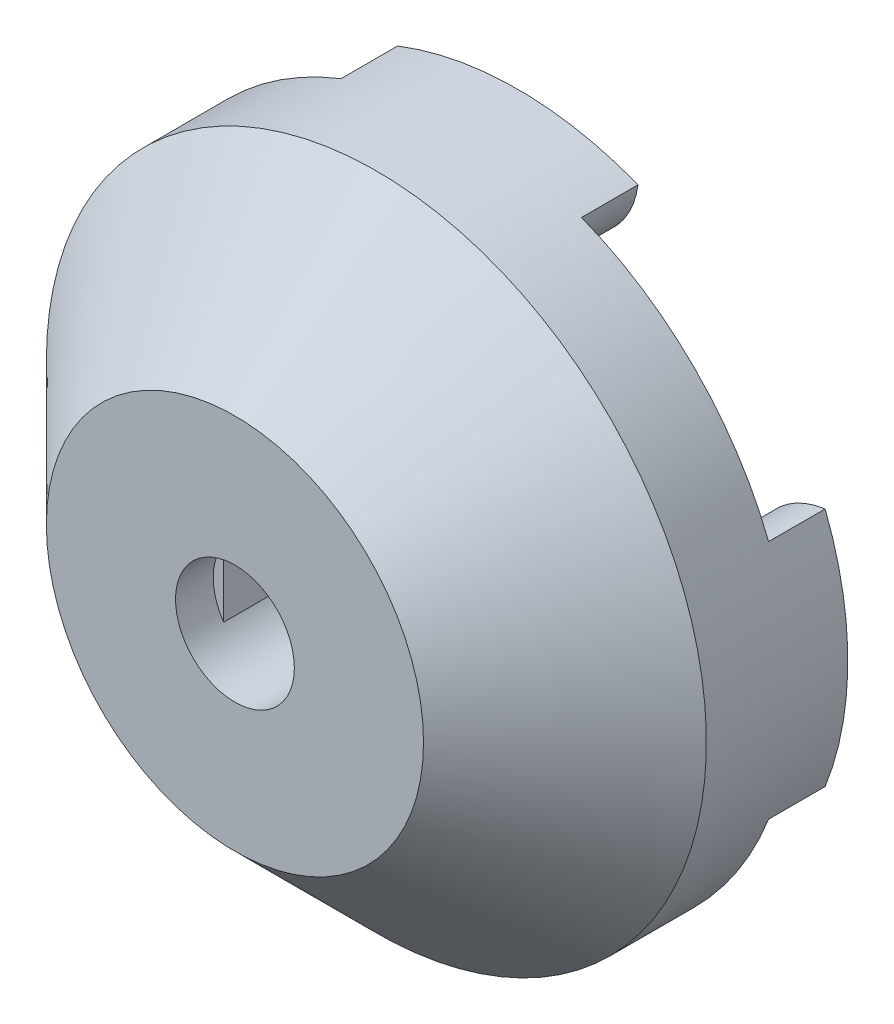
ISO-10303-21;
HEADER;
FILE_DESCRIPTION(('STEP AP214'),'2;1');
FILE_NAME('part.step','',(''),(''),'','','');
FILE_SCHEMA(('AUTOMOTIVE_DESIGN { 1 0 10303 214 1 1 1 1 }'));
ENDSEC;
DATA;
#1=APPLICATION_CONTEXT('core data for automotive mechanical design processes');
#2=APPLICATION_PROTOCOL_DEFINITION('international standard','automotive_design',2000,#1);
#3=PRODUCT_CONTEXT('',#1,'mechanical');
#4=PRODUCT('Part','Part','',(#3));
#5=PRODUCT_RELATED_PRODUCT_CATEGORY('part','',(#4));
#6=PRODUCT_DEFINITION_FORMATION('','',#4);
#7=PRODUCT_DEFINITION_CONTEXT('part definition',#1,'design');
#8=PRODUCT_DEFINITION('design','',#6,#7);
#9=PRODUCT_DEFINITION_SHAPE('','',#8);
#10=(LENGTH_UNIT() NAMED_UNIT(*) SI_UNIT(.MILLI.,.METRE.));
#11=(NAMED_UNIT(*) PLANE_ANGLE_UNIT() SI_UNIT($,.RADIAN.));
#12=(NAMED_UNIT(*) SI_UNIT($,.STERADIAN.) SOLID_ANGLE_UNIT());
#13=UNCERTAINTY_MEASURE_WITH_UNIT(LENGTH_MEASURE(1.E-05),#10,'distance_accuracy_value','');
#14=(GEOMETRIC_REPRESENTATION_CONTEXT(3) GLOBAL_UNCERTAINTY_ASSIGNED_CONTEXT((#13)) GLOBAL_UNIT_ASSIGNED_CONTEXT((#10,
#11,#12)) REPRESENTATION_CONTEXT('',''));
#15=CARTESIAN_POINT('',(0.,0.,0.));
#16=DIRECTION('',(0.,0.,1.));
#17=DIRECTION('',(1.,0.,0.));
#18=AXIS2_PLACEMENT_3D('',#15,#16,#17);
#19=CARTESIAN_POINT('',(-2.6,1.77834192437787,-15.));
#20=DIRECTION('',(-1.,0.,0.));
#21=DIRECTION('',(0.,0.,1.));
#22=AXIS2_PLACEMENT_3D('',#19,#20,#21);
#23=PLANE('',#22);
#24=DIRECTION('',(0.,1.,0.));
#25=VECTOR('',#24,1.);
#26=CARTESIAN_POINT('',(-2.6,1.77834192437787,-2.));
#27=LINE('',#26,#25);
#28=CARTESIAN_POINT('',(-2.6,-1.77834192437787,-2.));
#29=VERTEX_POINT('',#28);
#30=CARTESIAN_POINT('',(-2.6,1.77834192437787,-2.));
#31=VERTEX_POINT('',#30);
#32=EDGE_CURVE('E167',#29,#31,#27,.T.);
#33=ORIENTED_EDGE('',*,*,#32,.F.);
#34=DIRECTION('',(0.,0.,1.));
#35=VECTOR('',#34,1.);
#36=CARTESIAN_POINT('',(-2.6,-1.77834192437787,-15.));
#37=LINE('',#36,#35);
#38=CARTESIAN_POINT('',(-2.6,-1.77834192437787,-11.5));
#39=VERTEX_POINT('',#38);
#40=EDGE_CURVE('E178',#39,#29,#37,.T.);
#41=ORIENTED_EDGE('',*,*,#40,.F.);
#42=DIRECTION('',(0.,-1.,0.));
#43=VECTOR('',#42,1.);
#44=CARTESIAN_POINT('',(-2.6,1.77834192437787,-11.5));
#45=LINE('',#44,#43);
#46=CARTESIAN_POINT('',(-2.6,1.77834192437787,-11.5));
#47=VERTEX_POINT('',#46);
#48=EDGE_CURVE('E175',#47,#39,#45,.T.);
#49=ORIENTED_EDGE('',*,*,#48,.F.);
#50=DIRECTION('',(0.,0.,1.));
#51=VECTOR('',#50,1.);
#52=CARTESIAN_POINT('',(-2.6,1.77834192437787,-15.));
#53=LINE('',#52,#51);
#54=EDGE_CURVE('E180',#47,#31,#53,.T.);
#55=ORIENTED_EDGE('',*,*,#54,.T.);
#56=EDGE_LOOP('',(#33,#41,#49,#55));
#57=FACE_BOUND('',#56,.T.);
#58=ADVANCED_FACE('F43',(#57),#23,.F.);
#59=CARTESIAN_POINT('',(0.,0.,-15.));
#60=DIRECTION('',(0.,0.,1.));
#61=DIRECTION('',(1.,0.,0.));
#62=AXIS2_PLACEMENT_3D('',#59,#60,#61);
#63=CYLINDRICAL_SURFACE('',#62,3.15);
#64=CARTESIAN_POINT('',(0.,0.,0.));
#65=DIRECTION('',(0.,0.,1.));
#66=DIRECTION('',(1.,0.,0.));
#67=AXIS2_PLACEMENT_3D('',#64,#65,#66);
#68=CIRCLE('',#67,3.15);
#69=CARTESIAN_POINT('',(3.15,0.,0.));
#70=VERTEX_POINT('',#69);
#71=EDGE_CURVE('E182',#70,#70,#68,.T.);
#72=ORIENTED_EDGE('',*,*,#71,.T.);
#73=EDGE_LOOP('',(#72));
#74=FACE_BOUND('',#73,.T.);
#75=ORIENTED_EDGE('',*,*,#40,.T.);
#76=CARTESIAN_POINT('',(0.,0.,-2.));
#77=DIRECTION('',(0.,0.,1.));
#78=DIRECTION('',(1.,0.,0.));
#79=AXIS2_PLACEMENT_3D('',#76,#77,#78);
#80=CIRCLE('',#79,3.15);
#81=EDGE_CURVE('E59',#31,#29,#80,.T.);
#82=ORIENTED_EDGE('',*,*,#81,.F.);
#83=ORIENTED_EDGE('',*,*,#54,.F.);
#84=CARTESIAN_POINT('',(0.,0.,-11.5));
#85=DIRECTION('',(0.,0.,-1.));
#86=DIRECTION('',(-1.,0.,0.));
#87=AXIS2_PLACEMENT_3D('',#84,#85,#86);
#88=CIRCLE('',#87,3.15);
#89=EDGE_CURVE('E61',#39,#47,#88,.F.);
#90=ORIENTED_EDGE('',*,*,#89,.F.);
#91=EDGE_LOOP('',(#75,#82,#83,#90));
#92=FACE_BOUND('',#91,.T.);
#93=ADVANCED_FACE('F176',(#74,#92),#63,.F.);
#94=CARTESIAN_POINT('',(0.,0.,-12.));
#95=DIRECTION('',(0.,0.,1.));
#96=DIRECTION('',(1.,0.,0.));
#97=AXIS2_PLACEMENT_3D('',#94,#95,#96);
#98=CYLINDRICAL_SURFACE('',#97,17.5);
#99=CARTESIAN_POINT('',(0.,0.,-7.50000000000003));
#100=DIRECTION('',(0.,0.,1.));
#101=DIRECTION('',(1.,0.,0.));
#102=AXIS2_PLACEMENT_3D('',#99,#100,#101);
#103=CIRCLE('',#102,17.5);
#104=CARTESIAN_POINT('',(-17.5,0.,-7.50000000000003));
#105=VERTEX_POINT('',#104);
#106=EDGE_CURVE('E11',#105,#105,#103,.F.);
#107=ORIENTED_EDGE('',*,*,#106,.T.);
#108=EDGE_LOOP('',(#107));
#109=FACE_BOUND('',#108,.T.);
#110=CARTESIAN_POINT('',(0.,0.,-12.));
#111=DIRECTION('',(0.,0.,1.));
#112=DIRECTION('',(1.,0.,0.));
#113=AXIS2_PLACEMENT_3D('',#110,#111,#112);
#114=CIRCLE('',#113,17.5);
#115=CARTESIAN_POINT('',(6.37499999999999,-16.2975266528391,-12.));
#116=VERTEX_POINT('',#115);
#117=CARTESIAN_POINT('',(16.2975266528391,-6.37499999999994,-12.));
#118=VERTEX_POINT('',#117);
#119=EDGE_CURVE('E313',#116,#118,#114,.T.);
#120=ORIENTED_EDGE('',*,*,#119,.T.);
#121=DIRECTION('',(0.,0.,1.));
#122=VECTOR('',#121,1.);
#123=CARTESIAN_POINT('',(16.2975266528391,-6.37499999999995,-15.));
#124=LINE('',#123,#122);
#125=CARTESIAN_POINT('',(16.2975266528391,-6.37499999999995,-15.));
#126=VERTEX_POINT('',#125);
#127=EDGE_CURVE('E218',#126,#118,#124,.T.);
#128=ORIENTED_EDGE('',*,*,#127,.F.);
#129=CARTESIAN_POINT('',(0.,0.,-15.));
#130=DIRECTION('',(0.,0.,-1.));
#131=DIRECTION('',(0.,-1.,0.));
#132=AXIS2_PLACEMENT_3D('',#129,#130,#131);
#133=CIRCLE('',#132,17.5);
#134=CARTESIAN_POINT('',(16.2975266528391,6.37500000000005,-15.));
#135=VERTEX_POINT('',#134);
#136=EDGE_CURVE('E191',#135,#126,#133,.T.);
#137=ORIENTED_EDGE('',*,*,#136,.F.);
#138=DIRECTION('',(0.,0.,1.));
#139=VECTOR('',#138,1.);
#140=CARTESIAN_POINT('',(16.2975266528391,6.37500000000005,-15.));
#141=LINE('',#140,#139);
#142=CARTESIAN_POINT('',(16.2975266528391,6.37500000000005,-12.));
#143=VERTEX_POINT('',#142);
#144=EDGE_CURVE('E203',#135,#143,#141,.T.);
#145=ORIENTED_EDGE('',*,*,#144,.T.);
#146=CARTESIAN_POINT('',(6.375,16.2975266528391,-12.));
#147=VERTEX_POINT('',#146);
#148=EDGE_CURVE('E312',#143,#147,#114,.T.);
#149=ORIENTED_EDGE('',*,*,#148,.T.);
#150=DIRECTION('',(0.,0.,1.));
#151=VECTOR('',#150,1.);
#152=CARTESIAN_POINT('',(6.375,16.2975266528391,-15.));
#153=LINE('',#152,#151);
#154=CARTESIAN_POINT('',(6.375,16.2975266528391,-15.));
#155=VERTEX_POINT('',#154);
#156=EDGE_CURVE('E206',#155,#147,#153,.T.);
#157=ORIENTED_EDGE('',*,*,#156,.F.);
#158=CARTESIAN_POINT('',(0.,0.,-15.));
#159=DIRECTION('',(0.,0.,-1.));
#160=DIRECTION('',(1.,0.,0.));
#161=AXIS2_PLACEMENT_3D('',#158,#159,#160);
#162=CIRCLE('',#161,17.5);
#163=CARTESIAN_POINT('',(-6.375,16.2975266528391,-15.));
#164=VERTEX_POINT('',#163);
#165=EDGE_CURVE('E224',#164,#155,#162,.T.);
#166=ORIENTED_EDGE('',*,*,#165,.F.);
#167=DIRECTION('',(0.,0.,1.));
#168=VECTOR('',#167,1.);
#169=CARTESIAN_POINT('',(-6.375,16.2975266528391,-15.));
#170=LINE('',#169,#168);
#171=CARTESIAN_POINT('',(-6.37499999999999,16.2975266528391,-12.));
#172=VERTEX_POINT('',#171);
#173=EDGE_CURVE('E233',#164,#172,#170,.T.);
#174=ORIENTED_EDGE('',*,*,#173,.T.);
#175=CARTESIAN_POINT('',(-16.2975266528391,6.37499999999983,-12.));
#176=VERTEX_POINT('',#175);
#177=EDGE_CURVE('E438',#172,#176,#114,.T.);
#178=ORIENTED_EDGE('',*,*,#177,.T.);
#179=DIRECTION('',(0.,0.,1.));
#180=VECTOR('',#179,1.);
#181=CARTESIAN_POINT('',(-16.2975266528391,6.37499999999983,-15.));
#182=LINE('',#181,#180);
#183=CARTESIAN_POINT('',(-16.2975266528391,6.37499999999983,-15.));
#184=VERTEX_POINT('',#183);
#185=EDGE_CURVE('E236',#184,#176,#182,.T.);
#186=ORIENTED_EDGE('',*,*,#185,.F.);
#187=CARTESIAN_POINT('',(0.,0.,-15.));
#188=DIRECTION('',(0.,0.,-1.));
#189=DIRECTION('',(0.,1.,0.));
#190=AXIS2_PLACEMENT_3D('',#187,#188,#189);
#191=CIRCLE('',#190,17.5);
#192=CARTESIAN_POINT('',(-16.297526652839,-6.37500000000017,-15.));
#193=VERTEX_POINT('',#192);
#194=EDGE_CURVE('E251',#193,#184,#191,.T.);
#195=ORIENTED_EDGE('',*,*,#194,.F.);
#196=DIRECTION('',(0.,0.,1.));
#197=VECTOR('',#196,1.);
#198=CARTESIAN_POINT('',(-16.297526652839,-6.37500000000017,-15.));
#199=LINE('',#198,#197);
#200=CARTESIAN_POINT('',(-16.297526652839,-6.37500000000016,-12.));
#201=VERTEX_POINT('',#200);
#202=EDGE_CURVE('E263',#193,#201,#199,.T.);
#203=ORIENTED_EDGE('',*,*,#202,.T.);
#204=CARTESIAN_POINT('',(-6.375,-16.2975266528391,-12.));
#205=VERTEX_POINT('',#204);
#206=EDGE_CURVE('E309',#201,#205,#114,.T.);
#207=ORIENTED_EDGE('',*,*,#206,.T.);
#208=DIRECTION('',(0.,0.,1.));
#209=VECTOR('',#208,1.);
#210=CARTESIAN_POINT('',(-6.375,-16.2975266528391,-15.));
#211=LINE('',#210,#209);
#212=CARTESIAN_POINT('',(-6.375,-16.2975266528391,-15.));
#213=VERTEX_POINT('',#212);
#214=EDGE_CURVE('E307',#213,#205,#211,.T.);
#215=ORIENTED_EDGE('',*,*,#214,.F.);
#216=CARTESIAN_POINT('',(0.,0.,-15.));
#217=DIRECTION('',(0.,0.,-1.));
#218=DIRECTION('',(-1.,0.,0.));
#219=AXIS2_PLACEMENT_3D('',#216,#217,#218);
#220=CIRCLE('',#219,17.5);
#221=CARTESIAN_POINT('',(6.375,-16.2975266528391,-15.));
#222=VERTEX_POINT('',#221);
#223=EDGE_CURVE('E282',#222,#213,#220,.T.);
#224=ORIENTED_EDGE('',*,*,#223,.F.);
#225=DIRECTION('',(0.,0.,1.));
#226=VECTOR('',#225,1.);
#227=CARTESIAN_POINT('',(6.375,-16.2975266528391,-15.));
#228=LINE('',#227,#226);
#229=EDGE_CURVE('E292',#222,#116,#228,.T.);
#230=ORIENTED_EDGE('',*,*,#229,.T.);
#231=EDGE_LOOP('',(#120,#128,#137,#145,#149,#157,#166,#174,#178,#186,#195,#203,#207,#215,#224,#230));
#232=FACE_BOUND('',#231,.T.);
#233=ADVANCED_FACE('F339',(#109,#232),#98,.T.);
#234=CARTESIAN_POINT('',(0.,0.,-12.));
#235=DIRECTION('',(0.,0.,1.));
#236=DIRECTION('',(1.,0.,0.));
#237=AXIS2_PLACEMENT_3D('',#234,#235,#236);
#238=PLANE('',#237);
#239=CARTESIAN_POINT('',(0.,0.,-12.));
#240=DIRECTION('',(0.,0.,1.));
#241=DIRECTION('',(1.,0.,0.));
#242=AXIS2_PLACEMENT_3D('',#239,#240,#241);
#243=CIRCLE('',#242,6.);
#244=CARTESIAN_POINT('',(6.,0.,-12.));
#245=VERTEX_POINT('',#244);
#246=EDGE_CURVE('E314',#245,#245,#243,.F.);
#247=ORIENTED_EDGE('',*,*,#246,.F.);
#248=EDGE_LOOP('',(#247));
#249=FACE_BOUND('',#248,.T.);
#250=CARTESIAN_POINT('',(16.8918617262973,1.91442090974087,-12.));
#251=DIRECTION('',(0.,0.,-1.));
#252=DIRECTION('',(0.,-1.,0.));
#253=AXIS2_PLACEMENT_3D('',#250,#251,#252);
#254=CIRCLE('',#253,4.5);
#255=CARTESIAN_POINT('',(12.4204865634539,1.407662433633,-12.));
#256=VERTEX_POINT('',#255);
#257=EDGE_CURVE('E194',#256,#143,#254,.T.);
#258=ORIENTED_EDGE('',*,*,#257,.F.);
#259=CARTESIAN_POINT('',(2.20309881449054E-13,0.,-12.));
#260=DIRECTION('',(0.,0.,1.));
#261=DIRECTION('',(0.,1.,0.));
#262=AXIS2_PLACEMENT_3D('',#259,#260,#261);
#263=CIRCLE('',#262,12.4999999999998);
#264=CARTESIAN_POINT('',(12.4204865634539,-1.40766243363291,-12.));
#265=VERTEX_POINT('',#264);
#266=EDGE_CURVE('E202',#265,#256,#263,.T.);
#267=ORIENTED_EDGE('',*,*,#266,.F.);
#268=CARTESIAN_POINT('',(16.8918617262973,-1.91442090974076,-12.));
#269=DIRECTION('',(0.,0.,-1.));
#270=DIRECTION('',(0.,-1.,0.));
#271=AXIS2_PLACEMENT_3D('',#268,#269,#270);
#272=CIRCLE('',#271,4.5);
#273=EDGE_CURVE('E205',#118,#265,#272,.T.);
#274=ORIENTED_EDGE('',*,*,#273,.F.);
#275=ORIENTED_EDGE('',*,*,#119,.F.);
#276=CARTESIAN_POINT('',(1.91442090974081,-16.8918617262973,-12.));
#277=DIRECTION('',(0.,0.,-1.));
#278=DIRECTION('',(-1.,0.,0.));
#279=AXIS2_PLACEMENT_3D('',#276,#277,#278);
#280=CIRCLE('',#279,4.5);
#281=CARTESIAN_POINT('',(1.40766243363295,-12.4204865634539,-12.));
#282=VERTEX_POINT('',#281);
#283=EDGE_CURVE('E281',#282,#116,#280,.T.);
#284=ORIENTED_EDGE('',*,*,#283,.F.);
#285=CARTESIAN_POINT('',(0.,-2.20309881449055E-13,-12.));
#286=DIRECTION('',(0.,0.,1.));
#287=DIRECTION('',(1.,0.,0.));
#288=AXIS2_PLACEMENT_3D('',#285,#286,#287);
#289=CIRCLE('',#288,12.4999999999998);
#290=CARTESIAN_POINT('',(-1.40766243363296,-12.4204865634539,-12.));
#291=VERTEX_POINT('',#290);
#292=EDGE_CURVE('E294',#291,#282,#289,.T.);
#293=ORIENTED_EDGE('',*,*,#292,.F.);
#294=CARTESIAN_POINT('',(-1.91442090974082,-16.8918617262973,-12.));
#295=DIRECTION('',(0.,0.,-1.));
#296=DIRECTION('',(-1.,0.,0.));
#297=AXIS2_PLACEMENT_3D('',#294,#295,#296);
#298=CIRCLE('',#297,4.5);
#299=EDGE_CURVE('E225',#205,#291,#298,.T.);
#300=ORIENTED_EDGE('',*,*,#299,.F.);
#301=ORIENTED_EDGE('',*,*,#206,.F.);
#302=CARTESIAN_POINT('',(-16.8918617262973,-1.91442090974099,-12.));
#303=DIRECTION('',(0.,0.,-1.));
#304=DIRECTION('',(0.,1.,0.));
#305=AXIS2_PLACEMENT_3D('',#302,#303,#304);
#306=CIRCLE('',#305,4.5);
#307=CARTESIAN_POINT('',(-12.4204865634539,-1.40766243363308,-12.));
#308=VERTEX_POINT('',#307);
#309=EDGE_CURVE('E260',#308,#201,#306,.T.);
#310=ORIENTED_EDGE('',*,*,#309,.F.);
#311=CARTESIAN_POINT('',(-2.20309881449054E-13,0.,-12.));
#312=DIRECTION('',(0.,0.,1.));
#313=DIRECTION('',(0.,-1.,0.));
#314=AXIS2_PLACEMENT_3D('',#311,#312,#313);
#315=CIRCLE('',#314,12.4999999999998);
#316=CARTESIAN_POINT('',(-12.4204865634539,1.40766243363283,-12.));
#317=VERTEX_POINT('',#316);
#318=EDGE_CURVE('E266',#317,#308,#315,.T.);
#319=ORIENTED_EDGE('',*,*,#318,.F.);
#320=CARTESIAN_POINT('',(-16.8918617262973,1.91442090974064,-12.));
#321=DIRECTION('',(0.,0.,-1.));
#322=DIRECTION('',(0.,1.,0.));
#323=AXIS2_PLACEMENT_3D('',#320,#321,#322);
#324=CIRCLE('',#323,4.5);
#325=EDGE_CURVE('E186',#176,#317,#324,.T.);
#326=ORIENTED_EDGE('',*,*,#325,.F.);
#327=ORIENTED_EDGE('',*,*,#177,.F.);
#328=CARTESIAN_POINT('',(-1.91442090974081,16.8918617262973,-12.));
#329=DIRECTION('',(0.,0.,-1.));
#330=DIRECTION('',(1.,0.,0.));
#331=AXIS2_PLACEMENT_3D('',#328,#329,#330);
#332=CIRCLE('',#331,4.5);
#333=CARTESIAN_POINT('',(-1.40766243363295,12.4204865634539,-12.));
#334=VERTEX_POINT('',#333);
#335=EDGE_CURVE('E230',#334,#172,#332,.T.);
#336=ORIENTED_EDGE('',*,*,#335,.F.);
#337=CARTESIAN_POINT('',(0.,2.20309881449055E-13,-12.));
#338=DIRECTION('',(0.,0.,1.));
#339=DIRECTION('',(-1.,0.,0.));
#340=AXIS2_PLACEMENT_3D('',#337,#338,#339);
#341=CIRCLE('',#340,12.4999999999998);
#342=CARTESIAN_POINT('',(1.40766243363296,12.4204865634539,-12.));
#343=VERTEX_POINT('',#342);
#344=EDGE_CURVE('E240',#343,#334,#341,.T.);
#345=ORIENTED_EDGE('',*,*,#344,.F.);
#346=CARTESIAN_POINT('',(1.91442090974082,16.8918617262973,-12.));
#347=DIRECTION('',(0.,0.,-1.));
#348=DIRECTION('',(1.,0.,0.));
#349=AXIS2_PLACEMENT_3D('',#346,#347,#348);
#350=CIRCLE('',#349,4.5);
#351=EDGE_CURVE('E232',#147,#343,#350,.T.);
#352=ORIENTED_EDGE('',*,*,#351,.F.);
#353=ORIENTED_EDGE('',*,*,#148,.F.);
#354=EDGE_LOOP('',(#258,#267,#274,#275,#284,#293,#300,#301,#310,#319,#326,#327,#336,#345,#352,#353));
#355=FACE_BOUND('',#354,.T.);
#356=ADVANCED_FACE('F416',(#249,#355),#238,.F.);
#357=CARTESIAN_POINT('',(0.,0.,0.));
#358=DIRECTION('',(0.,0.,1.));
#359=DIRECTION('',(1.,0.,0.));
#360=AXIS2_PLACEMENT_3D('',#357,#358,#359);
#361=PLANE('',#360);
#362=CARTESIAN_POINT('',(0.,0.,0.));
#363=DIRECTION('',(0.,0.,1.));
#364=DIRECTION('',(1.,0.,0.));
#365=AXIS2_PLACEMENT_3D('',#362,#363,#364);
#366=CIRCLE('',#365,10.);
#367=CARTESIAN_POINT('',(-10.,0.,0.));
#368=VERTEX_POINT('',#367);
#369=EDGE_CURVE('E55',#368,#368,#366,.T.);
#370=ORIENTED_EDGE('',*,*,#369,.T.);
#371=EDGE_LOOP('',(#370));
#372=FACE_BOUND('',#371,.T.);
#373=ORIENTED_EDGE('',*,*,#71,.F.);
#374=EDGE_LOOP('',(#373));
#375=FACE_BOUND('',#374,.T.);
#376=ADVANCED_FACE('F321',(#372,#375),#361,.T.);
#377=CARTESIAN_POINT('',(-1.91442090974082,-16.8918617262973,-15.));
#378=DIRECTION('',(0.,0.,1.));
#379=DIRECTION('',(1.,0.,0.));
#380=AXIS2_PLACEMENT_3D('',#377,#378,#379);
#381=CYLINDRICAL_SURFACE('',#380,4.5);
#382=ORIENTED_EDGE('',*,*,#299,.T.);
#383=DIRECTION('',(0.,0.,1.));
#384=VECTOR('',#383,1.);
#385=CARTESIAN_POINT('',(-1.40766243363296,-12.4204865634539,-15.));
#386=LINE('',#385,#384);
#387=CARTESIAN_POINT('',(-1.40766243363296,-12.4204865634539,-15.));
#388=VERTEX_POINT('',#387);
#389=EDGE_CURVE('E302',#388,#291,#386,.T.);
#390=ORIENTED_EDGE('',*,*,#389,.F.);
#391=CARTESIAN_POINT('',(-1.91442090974082,-16.8918617262973,-15.));
#392=DIRECTION('',(0.,0.,-1.));
#393=DIRECTION('',(-1.,0.,0.));
#394=AXIS2_PLACEMENT_3D('',#391,#392,#393);
#395=CIRCLE('',#394,4.5);
#396=EDGE_CURVE('E284',#213,#388,#395,.T.);
#397=ORIENTED_EDGE('',*,*,#396,.F.);
#398=ORIENTED_EDGE('',*,*,#214,.T.);
#399=EDGE_LOOP('',(#382,#390,#397,#398));
#400=FACE_BOUND('',#399,.T.);
#401=ADVANCED_FACE('F413',(#400),#381,.T.);
#402=CARTESIAN_POINT('',(0.,-2.20309881449055E-13,-15.));
#403=DIRECTION('',(0.,0.,1.));
#404=DIRECTION('',(1.,0.,0.));
#405=AXIS2_PLACEMENT_3D('',#402,#403,#404);
#406=CYLINDRICAL_SURFACE('',#405,12.4999999999998);
#407=ORIENTED_EDGE('',*,*,#292,.T.);
#408=DIRECTION('',(0.,0.,1.));
#409=VECTOR('',#408,1.);
#410=CARTESIAN_POINT('',(1.40766243363295,-12.4204865634539,-15.));
#411=LINE('',#410,#409);
#412=CARTESIAN_POINT('',(1.40766243363295,-12.4204865634539,-15.));
#413=VERTEX_POINT('',#412);
#414=EDGE_CURVE('E301',#413,#282,#411,.T.);
#415=ORIENTED_EDGE('',*,*,#414,.F.);
#416=CARTESIAN_POINT('',(0.,-2.20309881449055E-13,-15.));
#417=DIRECTION('',(0.,0.,1.));
#418=DIRECTION('',(1.,0.,0.));
#419=AXIS2_PLACEMENT_3D('',#416,#417,#418);
#420=CIRCLE('',#419,12.4999999999998);
#421=EDGE_CURVE('E290',#388,#413,#420,.T.);
#422=ORIENTED_EDGE('',*,*,#421,.F.);
#423=ORIENTED_EDGE('',*,*,#389,.T.);
#424=EDGE_LOOP('',(#407,#415,#422,#423));
#425=FACE_BOUND('',#424,.T.);
#426=ADVANCED_FACE('F409',(#425),#406,.F.);
#427=CARTESIAN_POINT('',(1.91442090974081,-16.8918617262973,-15.));
#428=DIRECTION('',(0.,0.,1.));
#429=DIRECTION('',(1.,0.,0.));
#430=AXIS2_PLACEMENT_3D('',#427,#428,#429);
#431=CYLINDRICAL_SURFACE('',#430,4.5);
#432=ORIENTED_EDGE('',*,*,#283,.T.);
#433=ORIENTED_EDGE('',*,*,#229,.F.);
#434=CARTESIAN_POINT('',(1.91442090974081,-16.8918617262973,-15.));
#435=DIRECTION('',(0.,0.,-1.));
#436=DIRECTION('',(-1.,0.,0.));
#437=AXIS2_PLACEMENT_3D('',#434,#435,#436);
#438=CIRCLE('',#437,4.5);
#439=EDGE_CURVE('E287',#413,#222,#438,.T.);
#440=ORIENTED_EDGE('',*,*,#439,.F.);
#441=ORIENTED_EDGE('',*,*,#414,.T.);
#442=EDGE_LOOP('',(#432,#433,#440,#441));
#443=FACE_BOUND('',#442,.T.);
#444=ADVANCED_FACE('F403',(#443),#431,.T.);
#445=CARTESIAN_POINT('',(-0.957210454870411,-8.44593086314864,-15.));
#446=DIRECTION('',(0.,0.,-1.));
#447=DIRECTION('',(-1.,0.,0.));
#448=AXIS2_PLACEMENT_3D('',#445,#446,#447);
#449=PLANE('',#448);
#450=ORIENTED_EDGE('',*,*,#223,.T.);
#451=ORIENTED_EDGE('',*,*,#396,.T.);
#452=ORIENTED_EDGE('',*,*,#421,.T.);
#453=ORIENTED_EDGE('',*,*,#439,.T.);
#454=EDGE_LOOP('',(#450,#451,#452,#453));
#455=FACE_BOUND('',#454,.T.);
#456=ADVANCED_FACE('F402',(#455),#449,.T.);
#457=CARTESIAN_POINT('',(-16.8918617262973,1.91442090974064,-15.));
#458=DIRECTION('',(0.,0.,1.));
#459=DIRECTION('',(1.,0.,0.));
#460=AXIS2_PLACEMENT_3D('',#457,#458,#459);
#461=CYLINDRICAL_SURFACE('',#460,4.5);
#462=ORIENTED_EDGE('',*,*,#325,.T.);
#463=DIRECTION('',(0.,0.,1.));
#464=VECTOR('',#463,1.);
#465=CARTESIAN_POINT('',(-12.4204865634539,1.40766243363283,-15.));
#466=LINE('',#465,#464);
#467=CARTESIAN_POINT('',(-12.4204865634539,1.40766243363283,-15.));
#468=VERTEX_POINT('',#467);
#469=EDGE_CURVE('E277',#468,#317,#466,.T.);
#470=ORIENTED_EDGE('',*,*,#469,.F.);
#471=CARTESIAN_POINT('',(-16.8918617262973,1.91442090974064,-15.));
#472=DIRECTION('',(0.,0.,-1.));
#473=DIRECTION('',(0.,1.,0.));
#474=AXIS2_PLACEMENT_3D('',#471,#472,#473);
#475=CIRCLE('',#474,4.5);
#476=EDGE_CURVE('E258',#184,#468,#475,.T.);
#477=ORIENTED_EDGE('',*,*,#476,.F.);
#478=ORIENTED_EDGE('',*,*,#185,.T.);
#479=EDGE_LOOP('',(#462,#470,#477,#478));
#480=FACE_BOUND('',#479,.T.);
#481=ADVANCED_FACE('F400',(#480),#461,.T.);
#482=CARTESIAN_POINT('',(-2.20309881449054E-13,0.,-15.));
#483=DIRECTION('',(0.,0.,1.));
#484=DIRECTION('',(1.,0.,0.));
#485=AXIS2_PLACEMENT_3D('',#482,#483,#484);
#486=CYLINDRICAL_SURFACE('',#485,12.4999999999998);
#487=ORIENTED_EDGE('',*,*,#318,.T.);
#488=DIRECTION('',(0.,0.,1.));
#489=VECTOR('',#488,1.);
#490=CARTESIAN_POINT('',(-12.4204865634539,-1.40766243363308,-15.));
#491=LINE('',#490,#489);
#492=CARTESIAN_POINT('',(-12.4204865634539,-1.40766243363308,-15.));
#493=VERTEX_POINT('',#492);
#494=EDGE_CURVE('E272',#493,#308,#491,.T.);
#495=ORIENTED_EDGE('',*,*,#494,.F.);
#496=CARTESIAN_POINT('',(-2.20309881449054E-13,0.,-15.));
#497=DIRECTION('',(0.,0.,1.));
#498=DIRECTION('',(0.,-1.,0.));
#499=AXIS2_PLACEMENT_3D('',#496,#497,#498);
#500=CIRCLE('',#499,12.4999999999998);
#501=EDGE_CURVE('E259',#468,#493,#500,.T.);
#502=ORIENTED_EDGE('',*,*,#501,.F.);
#503=ORIENTED_EDGE('',*,*,#469,.T.);
#504=EDGE_LOOP('',(#487,#495,#502,#503));
#505=FACE_BOUND('',#504,.T.);
#506=ADVANCED_FACE('F393',(#505),#486,.F.);
#507=CARTESIAN_POINT('',(-16.8918617262973,-1.91442090974099,-15.));
#508=DIRECTION('',(0.,0.,1.));
#509=DIRECTION('',(1.,0.,0.));
#510=AXIS2_PLACEMENT_3D('',#507,#508,#509);
#511=CYLINDRICAL_SURFACE('',#510,4.5);
#512=ORIENTED_EDGE('',*,*,#309,.T.);
#513=ORIENTED_EDGE('',*,*,#202,.F.);
#514=CARTESIAN_POINT('',(-16.8918617262973,-1.91442090974099,-15.));
#515=DIRECTION('',(0.,0.,-1.));
#516=DIRECTION('',(0.,1.,0.));
#517=AXIS2_PLACEMENT_3D('',#514,#515,#516);
#518=CIRCLE('',#517,4.5);
#519=EDGE_CURVE('E261',#493,#193,#518,.T.);
#520=ORIENTED_EDGE('',*,*,#519,.F.);
#521=ORIENTED_EDGE('',*,*,#494,.T.);
#522=EDGE_LOOP('',(#512,#513,#520,#521));
#523=FACE_BOUND('',#522,.T.);
#524=ADVANCED_FACE('F386',(#523),#511,.T.);
#525=CARTESIAN_POINT('',(-8.44593086314865,0.957210454870322,-15.));
#526=DIRECTION('',(0.,0.,-1.));
#527=DIRECTION('',(0.,1.,0.));
#528=AXIS2_PLACEMENT_3D('',#525,#526,#527);
#529=PLANE('',#528);
#530=ORIENTED_EDGE('',*,*,#194,.T.);
#531=ORIENTED_EDGE('',*,*,#476,.T.);
#532=ORIENTED_EDGE('',*,*,#501,.T.);
#533=ORIENTED_EDGE('',*,*,#519,.T.);
#534=EDGE_LOOP('',(#530,#531,#532,#533));
#535=FACE_BOUND('',#534,.T.);
#536=ADVANCED_FACE('F384',(#535),#529,.T.);
#537=CARTESIAN_POINT('',(1.91442090974082,16.8918617262973,-15.));
#538=DIRECTION('',(0.,0.,1.));
#539=DIRECTION('',(1.,0.,0.));
#540=AXIS2_PLACEMENT_3D('',#537,#538,#539);
#541=CYLINDRICAL_SURFACE('',#540,4.5);
#542=ORIENTED_EDGE('',*,*,#351,.T.);
#543=DIRECTION('',(0.,0.,1.));
#544=VECTOR('',#543,1.);
#545=CARTESIAN_POINT('',(1.40766243363296,12.4204865634539,-15.));
#546=LINE('',#545,#544);
#547=CARTESIAN_POINT('',(1.40766243363296,12.4204865634539,-15.));
#548=VERTEX_POINT('',#547);
#549=EDGE_CURVE('E248',#548,#343,#546,.T.);
#550=ORIENTED_EDGE('',*,*,#549,.F.);
#551=CARTESIAN_POINT('',(1.91442090974082,16.8918617262973,-15.));
#552=DIRECTION('',(0.,0.,-1.));
#553=DIRECTION('',(1.,0.,0.));
#554=AXIS2_PLACEMENT_3D('',#551,#552,#553);
#555=CIRCLE('',#554,4.5);
#556=EDGE_CURVE('E227',#155,#548,#555,.T.);
#557=ORIENTED_EDGE('',*,*,#556,.F.);
#558=ORIENTED_EDGE('',*,*,#156,.T.);
#559=EDGE_LOOP('',(#542,#550,#557,#558));
#560=FACE_BOUND('',#559,.T.);
#561=ADVANCED_FACE('F381',(#560),#541,.T.);
#562=CARTESIAN_POINT('',(0.,2.20309881449055E-13,-15.));
#563=DIRECTION('',(0.,0.,1.));
#564=DIRECTION('',(1.,0.,0.));
#565=AXIS2_PLACEMENT_3D('',#562,#563,#564);
#566=CYLINDRICAL_SURFACE('',#565,12.4999999999998);
#567=ORIENTED_EDGE('',*,*,#344,.T.);
#568=DIRECTION('',(0.,0.,1.));
#569=VECTOR('',#568,1.);
#570=CARTESIAN_POINT('',(-1.40766243363295,12.4204865634539,-15.));
#571=LINE('',#570,#569);
#572=CARTESIAN_POINT('',(-1.40766243363295,12.4204865634539,-15.));
#573=VERTEX_POINT('',#572);
#574=EDGE_CURVE('E241',#573,#334,#571,.T.);
#575=ORIENTED_EDGE('',*,*,#574,.F.);
#576=CARTESIAN_POINT('',(0.,2.20309881449055E-13,-15.));
#577=DIRECTION('',(0.,0.,1.));
#578=DIRECTION('',(-1.,0.,0.));
#579=AXIS2_PLACEMENT_3D('',#576,#577,#578);
#580=CIRCLE('',#579,12.4999999999998);
#581=EDGE_CURVE('E229',#548,#573,#580,.T.);
#582=ORIENTED_EDGE('',*,*,#581,.F.);
#583=ORIENTED_EDGE('',*,*,#549,.T.);
#584=EDGE_LOOP('',(#567,#575,#582,#583));
#585=FACE_BOUND('',#584,.T.);
#586=ADVANCED_FACE('F380',(#585),#566,.F.);
#587=CARTESIAN_POINT('',(-1.91442090974081,16.8918617262973,-15.));
#588=DIRECTION('',(0.,0.,1.));
#589=DIRECTION('',(1.,0.,0.));
#590=AXIS2_PLACEMENT_3D('',#587,#588,#589);
#591=CYLINDRICAL_SURFACE('',#590,4.5);
#592=ORIENTED_EDGE('',*,*,#335,.T.);
#593=ORIENTED_EDGE('',*,*,#173,.F.);
#594=CARTESIAN_POINT('',(-1.91442090974081,16.8918617262973,-15.));
#595=DIRECTION('',(0.,0.,-1.));
#596=DIRECTION('',(1.,0.,0.));
#597=AXIS2_PLACEMENT_3D('',#594,#595,#596);
#598=CIRCLE('',#597,4.5);
#599=EDGE_CURVE('E231',#573,#164,#598,.T.);
#600=ORIENTED_EDGE('',*,*,#599,.F.);
#601=ORIENTED_EDGE('',*,*,#574,.T.);
#602=EDGE_LOOP('',(#592,#593,#600,#601));
#603=FACE_BOUND('',#602,.T.);
#604=ADVANCED_FACE('F373',(#603),#591,.T.);
#605=CARTESIAN_POINT('',(0.957210454870411,8.44593086314864,-15.));
#606=DIRECTION('',(0.,0.,-1.));
#607=DIRECTION('',(1.,0.,0.));
#608=AXIS2_PLACEMENT_3D('',#605,#606,#607);
#609=PLANE('',#608);
#610=ORIENTED_EDGE('',*,*,#165,.T.);
#611=ORIENTED_EDGE('',*,*,#556,.T.);
#612=ORIENTED_EDGE('',*,*,#581,.T.);
#613=ORIENTED_EDGE('',*,*,#599,.T.);
#614=EDGE_LOOP('',(#610,#611,#612,#613));
#615=FACE_BOUND('',#614,.T.);
#616=ADVANCED_FACE('F369',(#615),#609,.T.);
#617=CARTESIAN_POINT('',(16.8918617262973,-1.91442090974076,-15.));
#618=DIRECTION('',(0.,0.,1.));
#619=DIRECTION('',(1.,0.,0.));
#620=AXIS2_PLACEMENT_3D('',#617,#618,#619);
#621=CYLINDRICAL_SURFACE('',#620,4.5);
#622=ORIENTED_EDGE('',*,*,#273,.T.);
#623=DIRECTION('',(0.,0.,1.));
#624=VECTOR('',#623,1.);
#625=CARTESIAN_POINT('',(12.4204865634539,-1.40766243363291,-15.));
#626=LINE('',#625,#624);
#627=CARTESIAN_POINT('',(12.4204865634539,-1.40766243363291,-15.));
#628=VERTEX_POINT('',#627);
#629=EDGE_CURVE('E216',#628,#265,#626,.T.);
#630=ORIENTED_EDGE('',*,*,#629,.F.);
#631=CARTESIAN_POINT('',(16.8918617262973,-1.91442090974076,-15.));
#632=DIRECTION('',(0.,0.,-1.));
#633=DIRECTION('',(0.,-1.,0.));
#634=AXIS2_PLACEMENT_3D('',#631,#632,#633);
#635=CIRCLE('',#634,4.5);
#636=EDGE_CURVE('E192',#126,#628,#635,.T.);
#637=ORIENTED_EDGE('',*,*,#636,.F.);
#638=ORIENTED_EDGE('',*,*,#127,.T.);
#639=EDGE_LOOP('',(#622,#630,#637,#638));
#640=FACE_BOUND('',#639,.T.);
#641=ADVANCED_FACE('F364',(#640),#621,.T.);
#642=CARTESIAN_POINT('',(2.20309881449054E-13,0.,-15.));
#643=DIRECTION('',(0.,0.,1.));
#644=DIRECTION('',(1.,0.,0.));
#645=AXIS2_PLACEMENT_3D('',#642,#643,#644);
#646=CYLINDRICAL_SURFACE('',#645,12.4999999999998);
#647=ORIENTED_EDGE('',*,*,#266,.T.);
#648=DIRECTION('',(0.,0.,1.));
#649=VECTOR('',#648,1.);
#650=CARTESIAN_POINT('',(12.4204865634539,1.407662433633,-15.));
#651=LINE('',#650,#649);
#652=CARTESIAN_POINT('',(12.4204865634539,1.407662433633,-15.));
#653=VERTEX_POINT('',#652);
#654=EDGE_CURVE('E213',#653,#256,#651,.T.);
#655=ORIENTED_EDGE('',*,*,#654,.F.);
#656=CARTESIAN_POINT('',(2.20309881449054E-13,0.,-15.));
#657=DIRECTION('',(0.,0.,1.));
#658=DIRECTION('',(0.,1.,0.));
#659=AXIS2_PLACEMENT_3D('',#656,#657,#658);
#660=CIRCLE('',#659,12.4999999999998);
#661=EDGE_CURVE('E197',#628,#653,#660,.T.);
#662=ORIENTED_EDGE('',*,*,#661,.F.);
#663=ORIENTED_EDGE('',*,*,#629,.T.);
#664=EDGE_LOOP('',(#647,#655,#662,#663));
#665=FACE_BOUND('',#664,.T.);
#666=ADVANCED_FACE('F363',(#665),#646,.F.);
#667=CARTESIAN_POINT('',(16.8918617262973,1.91442090974087,-15.));
#668=DIRECTION('',(0.,0.,1.));
#669=DIRECTION('',(1.,0.,0.));
#670=AXIS2_PLACEMENT_3D('',#667,#668,#669);
#671=CYLINDRICAL_SURFACE('',#670,4.5);
#672=ORIENTED_EDGE('',*,*,#257,.T.);
#673=ORIENTED_EDGE('',*,*,#144,.F.);
#674=CARTESIAN_POINT('',(16.8918617262973,1.91442090974087,-15.));
#675=DIRECTION('',(0.,0.,-1.));
#676=DIRECTION('',(0.,-1.,0.));
#677=AXIS2_PLACEMENT_3D('',#674,#675,#676);
#678=CIRCLE('',#677,4.5);
#679=EDGE_CURVE('E200',#653,#135,#678,.T.);
#680=ORIENTED_EDGE('',*,*,#679,.F.);
#681=ORIENTED_EDGE('',*,*,#654,.T.);
#682=EDGE_LOOP('',(#672,#673,#680,#681));
#683=FACE_BOUND('',#682,.T.);
#684=ADVANCED_FACE('F360',(#683),#671,.T.);
#685=CARTESIAN_POINT('',(8.44593086314865,-0.957210454870381,-15.));
#686=DIRECTION('',(0.,0.,-1.));
#687=DIRECTION('',(0.,-1.,0.));
#688=AXIS2_PLACEMENT_3D('',#685,#686,#687);
#689=PLANE('',#688);
#690=ORIENTED_EDGE('',*,*,#136,.T.);
#691=ORIENTED_EDGE('',*,*,#636,.T.);
#692=ORIENTED_EDGE('',*,*,#661,.T.);
#693=ORIENTED_EDGE('',*,*,#679,.T.);
#694=EDGE_LOOP('',(#690,#691,#692,#693));
#695=FACE_BOUND('',#694,.T.);
#696=ADVANCED_FACE('F353',(#695),#689,.T.);
#697=CARTESIAN_POINT('',(0.,0.,-15.));
#698=DIRECTION('',(0.,0.,1.));
#699=DIRECTION('',(1.,0.,0.));
#700=AXIS2_PLACEMENT_3D('',#697,#698,#699);
#701=CYLINDRICAL_SURFACE('',#700,6.);
#702=CARTESIAN_POINT('',(0.,0.,-15.));
#703=DIRECTION('',(0.,0.,-1.));
#704=DIRECTION('',(-1.,0.,0.));
#705=AXIS2_PLACEMENT_3D('',#702,#703,#704);
#706=CIRCLE('',#705,6.);
#707=CARTESIAN_POINT('',(-6.,0.,-15.));
#708=VERTEX_POINT('',#707);
#709=EDGE_CURVE('E181',#708,#708,#706,.T.);
#710=ORIENTED_EDGE('',*,*,#709,.F.);
#711=EDGE_LOOP('',(#710));
#712=FACE_BOUND('',#711,.T.);
#713=ORIENTED_EDGE('',*,*,#246,.T.);
#714=EDGE_LOOP('',(#713));
#715=FACE_BOUND('',#714,.T.);
#716=ADVANCED_FACE('F349',(#712,#715),#701,.T.);
#717=CARTESIAN_POINT('',(0.,0.,-15.));
#718=DIRECTION('',(0.,0.,-1.));
#719=DIRECTION('',(-1.,0.,0.));
#720=AXIS2_PLACEMENT_3D('',#717,#718,#719);
#721=PLANE('',#720);
#722=CARTESIAN_POINT('',(0.,0.,-15.));
#723=DIRECTION('',(0.,0.,-1.));
#724=DIRECTION('',(-1.,0.,0.));
#725=AXIS2_PLACEMENT_3D('',#722,#723,#724);
#726=CIRCLE('',#725,3.5);
#727=CARTESIAN_POINT('',(-3.5,0.,-15.));
#728=VERTEX_POINT('',#727);
#729=EDGE_CURVE('E177',#728,#728,#726,.T.);
#730=ORIENTED_EDGE('',*,*,#729,.F.);
#731=EDGE_LOOP('',(#730));
#732=FACE_BOUND('',#731,.T.);
#733=ORIENTED_EDGE('',*,*,#709,.T.);
#734=EDGE_LOOP('',(#733));
#735=FACE_BOUND('',#734,.T.);
#736=ADVANCED_FACE('F344',(#732,#735),#721,.T.);
#737=CARTESIAN_POINT('',(0.,0.,-11.5));
#738=DIRECTION('',(0.,0.,-1.));
#739=DIRECTION('',(-1.,0.,0.));
#740=AXIS2_PLACEMENT_3D('',#737,#738,#739);
#741=PLANE('',#740);
#742=CARTESIAN_POINT('',(0.,0.,-11.5));
#743=DIRECTION('',(0.,0.,-1.));
#744=DIRECTION('',(-1.,0.,0.));
#745=AXIS2_PLACEMENT_3D('',#742,#743,#744);
#746=CIRCLE('',#745,3.5);
#747=CARTESIAN_POINT('',(-3.5,0.,-11.5));
#748=VERTEX_POINT('',#747);
#749=EDGE_CURVE('E633',#748,#748,#746,.T.);
#750=ORIENTED_EDGE('',*,*,#749,.T.);
#751=EDGE_LOOP('',(#750));
#752=FACE_BOUND('',#751,.T.);
#753=ORIENTED_EDGE('',*,*,#89,.T.);
#754=ORIENTED_EDGE('',*,*,#48,.T.);
#755=EDGE_LOOP('',(#753,#754));
#756=FACE_BOUND('',#755,.T.);
#757=ADVANCED_FACE('F346',(#752,#756),#741,.T.);
#758=CARTESIAN_POINT('',(0.,0.,-11.5));
#759=DIRECTION('',(0.,0.,-1.));
#760=DIRECTION('',(-1.,0.,0.));
#761=AXIS2_PLACEMENT_3D('',#758,#759,#760);
#762=CYLINDRICAL_SURFACE('',#761,3.5);
#763=ORIENTED_EDGE('',*,*,#749,.F.);
#764=EDGE_LOOP('',(#763));
#765=FACE_BOUND('',#764,.T.);
#766=ORIENTED_EDGE('',*,*,#729,.T.);
#767=EDGE_LOOP('',(#766));
#768=FACE_BOUND('',#767,.T.);
#769=ADVANCED_FACE('F329',(#765,#768),#762,.F.);
#770=CARTESIAN_POINT('',(0.,0.,-2.));
#771=DIRECTION('',(0.,0.,1.));
#772=DIRECTION('',(1.,0.,0.));
#773=AXIS2_PLACEMENT_3D('',#770,#771,#772);
#774=PLANE('',#773);
#775=ORIENTED_EDGE('',*,*,#32,.T.);
#776=ORIENTED_EDGE('',*,*,#81,.T.);
#777=EDGE_LOOP('',(#775,#776));
#778=FACE_BOUND('',#777,.T.);
#779=ADVANCED_FACE('F170',(#778),#774,.T.);
#780=CARTESIAN_POINT('',(0.,0.,0.));
#781=DIRECTION('',(0.,0.,-1.));
#782=DIRECTION('',(-1.,0.,0.));
#783=AXIS2_PLACEMENT_3D('',#780,#781,#782);
#784=CONICAL_SURFACE('',#783,10.,0.785398163397446);
#785=CARTESIAN_POINT('',(-17.5,0.,-7.50000000000003));
#786=CARTESIAN_POINT('',(-17.421875,0.,-7.42187500000003));
#787=CARTESIAN_POINT('',(-17.34375,0.,-7.34375000000003));
#788=CARTESIAN_POINT('',(-17.1875,0.,-7.18750000000003));
#789=CARTESIAN_POINT('',(-17.109375,0.,-7.10937500000003));
#790=CARTESIAN_POINT('',(-16.953125,0.,-6.95312500000003));
#791=CARTESIAN_POINT('',(-16.875,0.,-6.87500000000003));
#792=CARTESIAN_POINT('',(-16.71875,0.,-6.71875000000003));
#793=CARTESIAN_POINT('',(-16.640625,0.,-6.64062500000003));
#794=CARTESIAN_POINT('',(-16.484375,0.,-6.48437500000003));
#795=CARTESIAN_POINT('',(-16.40625,0.,-6.40625000000003));
#796=CARTESIAN_POINT('',(-16.25,0.,-6.25000000000003));
#797=CARTESIAN_POINT('',(-16.171875,0.,-6.17187500000003));
#798=CARTESIAN_POINT('',(-16.015625,0.,-6.01562500000002));
#799=CARTESIAN_POINT('',(-15.9375,0.,-5.93750000000002));
#800=CARTESIAN_POINT('',(-15.78125,0.,-5.78125000000002));
#801=CARTESIAN_POINT('',(-15.703125,0.,-5.70312500000002));
#802=CARTESIAN_POINT('',(-15.546875,0.,-5.54687500000002));
#803=CARTESIAN_POINT('',(-15.46875,0.,-5.46875000000002));
#804=CARTESIAN_POINT('',(-15.3125,0.,-5.31250000000002));
#805=CARTESIAN_POINT('',(-15.234375,0.,-5.23437500000002));
#806=CARTESIAN_POINT('',(-15.078125,0.,-5.07812500000002));
#807=CARTESIAN_POINT('',(-15.,0.,-5.00000000000002));
#808=CARTESIAN_POINT('',(-14.84375,0.,-4.84375000000002));
#809=CARTESIAN_POINT('',(-14.765625,0.,-4.76562500000002));
#810=CARTESIAN_POINT('',(-14.609375,0.,-4.60937500000002));
#811=CARTESIAN_POINT('',(-14.53125,0.,-4.53125000000002));
#812=CARTESIAN_POINT('',(-14.375,0.,-4.37500000000002));
#813=CARTESIAN_POINT('',(-14.296875,0.,-4.29687500000002));
#814=CARTESIAN_POINT('',(-14.140625,0.,-4.14062500000002));
#815=CARTESIAN_POINT('',(-14.0625,0.,-4.06250000000002));
#816=CARTESIAN_POINT('',(-13.90625,0.,-3.90625000000002));
#817=CARTESIAN_POINT('',(-13.828125,0.,-3.82812500000002));
#818=CARTESIAN_POINT('',(-13.671875,0.,-3.67187500000002));
#819=CARTESIAN_POINT('',(-13.59375,0.,-3.59375000000002));
#820=CARTESIAN_POINT('',(-13.4375,0.,-3.43750000000001));
#821=CARTESIAN_POINT('',(-13.359375,0.,-3.35937500000001));
#822=CARTESIAN_POINT('',(-13.203125,0.,-3.20312500000001));
#823=CARTESIAN_POINT('',(-13.125,0.,-3.12500000000001));
#824=CARTESIAN_POINT('',(-12.96875,0.,-2.96875000000001));
#825=CARTESIAN_POINT('',(-12.890625,0.,-2.89062500000001));
#826=CARTESIAN_POINT('',(-12.734375,0.,-2.73437500000001));
#827=CARTESIAN_POINT('',(-12.65625,0.,-2.65625000000001));
#828=CARTESIAN_POINT('',(-12.5,0.,-2.50000000000001));
#829=CARTESIAN_POINT('',(-12.421875,0.,-2.42187500000001));
#830=CARTESIAN_POINT('',(-12.265625,0.,-2.26562500000001));
#831=CARTESIAN_POINT('',(-12.1875,0.,-2.18750000000001));
#832=CARTESIAN_POINT('',(-12.03125,0.,-2.03125000000001));
#833=CARTESIAN_POINT('',(-11.953125,0.,-1.95312500000001));
#834=CARTESIAN_POINT('',(-11.796875,0.,-1.79687500000001));
#835=CARTESIAN_POINT('',(-11.71875,0.,-1.71875000000001));
#836=CARTESIAN_POINT('',(-11.5625,0.,-1.56250000000001));
#837=CARTESIAN_POINT('',(-11.484375,0.,-1.48437500000001));
#838=CARTESIAN_POINT('',(-11.328125,0.,-1.32812500000001));
#839=CARTESIAN_POINT('',(-11.25,0.,-1.25000000000001));
#840=CARTESIAN_POINT('',(-11.09375,0.,-1.09375));
#841=CARTESIAN_POINT('',(-11.015625,0.,-1.015625));
#842=CARTESIAN_POINT('',(-10.859375,0.,-0.859375000000004));
#843=CARTESIAN_POINT('',(-10.78125,0.,-0.781250000000004));
#844=CARTESIAN_POINT('',(-10.625,0.,-0.625000000000003));
#845=CARTESIAN_POINT('',(-10.546875,0.,-0.546875000000002));
#846=CARTESIAN_POINT('',(-10.390625,0.,-0.390625000000002));
#847=CARTESIAN_POINT('',(-10.3125,0.,-0.312500000000001));
#848=CARTESIAN_POINT('',(-10.15625,0.,-0.156250000000001));
#849=CARTESIAN_POINT('',(-10.078125,0.,-0.0781250000000003));
#850=CARTESIAN_POINT('',(-10.,0.,0.));
#851=B_SPLINE_CURVE_WITH_KNOTS('',3,(#785,#786,#787,#788,#789,#790,#791,#792,#793,#794,#795,
#796,#797,#798,#799,#800,#801,#802,#803,#804,#805,#806,#807,#808,#809,#810,#811,#812,#813,#814,
#815,#816,#817,#818,#819,#820,#821,#822,#823,#824,#825,#826,#827,#828,#829,#830,#831,#832,#833,
#834,#835,#836,#837,#838,#839,#840,#841,#842,#843,#844,#845,#846,#847,#848,#849,#850),
.UNSPECIFIED.,.F.,.F.,(4,2,2,2,2,2,2,2,2,2,2,2,2,2,2,2,2,2,2,2,2,2,2,2,2,2,2,2,2,2,2,2,4),(0.,
0.331456303681194,0.66291260736239,0.994368911043584,1.32582521472478,1.65728151840597,
1.98873782208717,2.32019412576836,2.65165042944956,2.98310673313075,3.31456303681195,
3.64601934049314,3.97747564417434,4.30893194785553,4.64038825153673,4.97184455521792,
5.30330085889912,5.63475716258031,5.96621346626151,6.2976697699427,6.6291260736239,
6.96058237730509,7.29203868098629,7.62349498466748,7.95495128834868,8.28640759202987,
8.61786389571107,8.94932019939226,9.28077650307346,9.61223280675465,9.94368911043585,
10.275145414117,10.6066017177982),.UNSPECIFIED.);
#852=EDGE_CURVE('BSEAM46',#105,#368,#851,.T.);
#853=ORIENTED_EDGE('',*,*,#106,.F.);
#854=ORIENTED_EDGE('',*,*,#369,.F.);
#855=ORIENTED_EDGE('',*,*,#852,.T.);
#856=ORIENTED_EDGE('',*,*,#852,.F.);
#857=EDGE_LOOP('',(#853,#855,#854,#856));
#858=FACE_BOUND('',#857,.T.);
#859=ADVANCED_FACE('F46',(#858),#784,.T.);
#860=CLOSED_SHELL('',(#58,#93,#233,#356,#376,#401,#426,#444,#456,#481,#506,#524,#536,#561,#586,
#604,#616,#641,#666,#684,#696,#716,#736,#757,#769,#779,#859));
#861=MANIFOLD_SOLID_BREP('B2',#860);
#862=ADVANCED_BREP_SHAPE_REPRESENTATION('',(#18,#861),#14);
#863=SHAPE_DEFINITION_REPRESENTATION(#9,#862);
ENDSEC;
END-ISO-10303-21;
